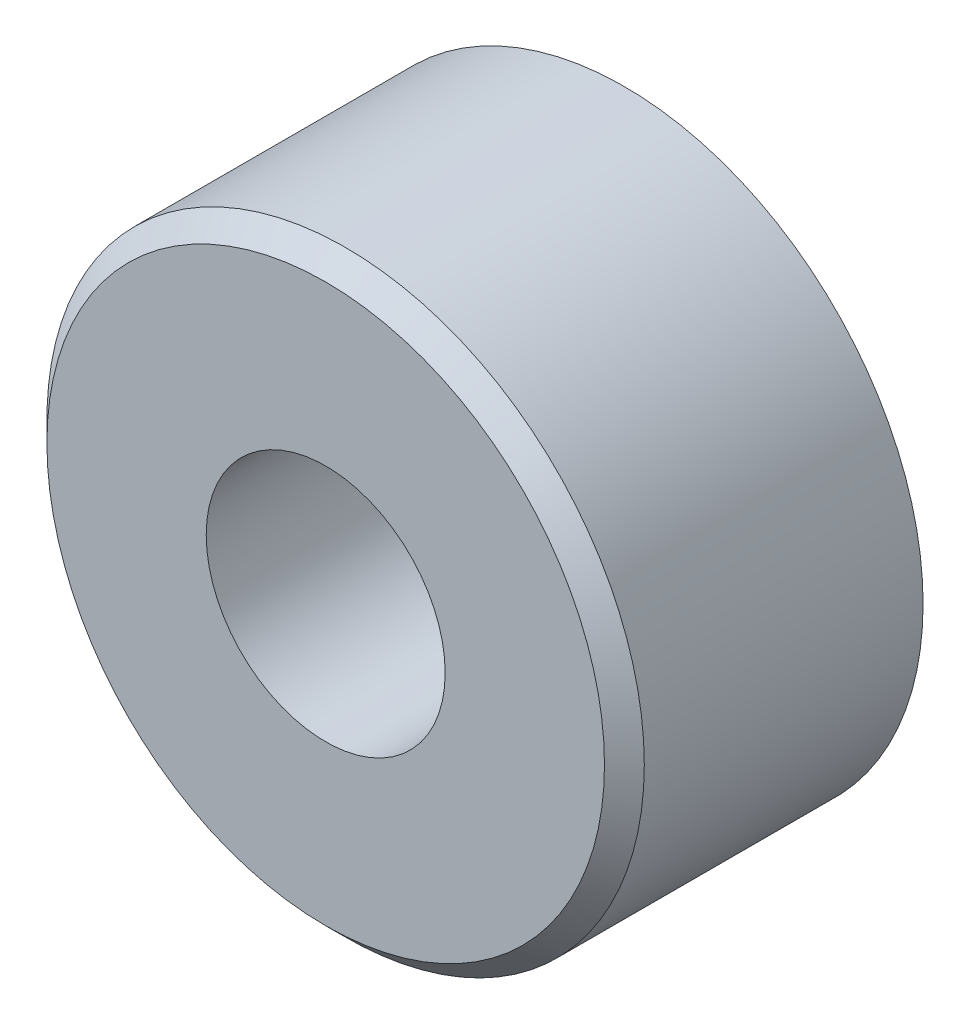
ISO-10303-21;
HEADER;
FILE_DESCRIPTION(('STEP AP214'),'2;1');
FILE_NAME('part.step','',(''),(''),'','','');
FILE_SCHEMA(('AUTOMOTIVE_DESIGN { 1 0 10303 214 1 1 1 1 }'));
ENDSEC;
DATA;
#1=APPLICATION_CONTEXT('core data for automotive mechanical design processes');
#2=APPLICATION_PROTOCOL_DEFINITION('international standard','automotive_design',2000,#1);
#3=PRODUCT_CONTEXT('',#1,'mechanical');
#4=PRODUCT('Part','Part','',(#3));
#5=PRODUCT_RELATED_PRODUCT_CATEGORY('part','',(#4));
#6=PRODUCT_DEFINITION_FORMATION('','',#4);
#7=PRODUCT_DEFINITION_CONTEXT('part definition',#1,'design');
#8=PRODUCT_DEFINITION('design','',#6,#7);
#9=PRODUCT_DEFINITION_SHAPE('','',#8);
#10=(LENGTH_UNIT() NAMED_UNIT(*) SI_UNIT(.MILLI.,.METRE.));
#11=(NAMED_UNIT(*) PLANE_ANGLE_UNIT() SI_UNIT($,.RADIAN.));
#12=(NAMED_UNIT(*) SI_UNIT($,.STERADIAN.) SOLID_ANGLE_UNIT());
#13=UNCERTAINTY_MEASURE_WITH_UNIT(LENGTH_MEASURE(1.E-05),#10,'distance_accuracy_value','');
#14=(GEOMETRIC_REPRESENTATION_CONTEXT(3) GLOBAL_UNCERTAINTY_ASSIGNED_CONTEXT((#13)) GLOBAL_UNIT_ASSIGNED_CONTEXT((#10,
#11,#12)) REPRESENTATION_CONTEXT('',''));
#15=CARTESIAN_POINT('',(0.,0.,0.));
#16=DIRECTION('',(0.,0.,1.));
#17=DIRECTION('',(1.,0.,0.));
#18=AXIS2_PLACEMENT_3D('',#15,#16,#17);
#19=CARTESIAN_POINT('',(0.,0.,7.5));
#20=DIRECTION('',(0.,0.,1.));
#21=DIRECTION('',(1.,0.,0.));
#22=AXIS2_PLACEMENT_3D('',#19,#20,#21);
#23=PLANE('',#22);
#24=CARTESIAN_POINT('',(0.,0.,7.5));
#25=DIRECTION('',(0.,0.,1.));
#26=DIRECTION('',(1.,0.,0.));
#27=AXIS2_PLACEMENT_3D('',#24,#25,#26);
#28=CIRCLE('',#27,7.);
#29=CARTESIAN_POINT('',(7.,0.,7.5));
#30=VERTEX_POINT('',#29);
#31=EDGE_CURVE('E49',#30,#30,#28,.T.);
#32=ORIENTED_EDGE('',*,*,#31,.T.);
#33=EDGE_LOOP('',(#32));
#34=FACE_BOUND('',#33,.T.);
#35=CARTESIAN_POINT('',(0.,0.,7.5));
#36=DIRECTION('',(0.,0.,1.));
#37=DIRECTION('',(1.,0.,0.));
#38=AXIS2_PLACEMENT_3D('',#35,#36,#37);
#39=CIRCLE('',#38,3.);
#40=CARTESIAN_POINT('',(3.,0.,7.5));
#41=VERTEX_POINT('',#40);
#42=EDGE_CURVE('E59',#41,#41,#39,.T.);
#43=ORIENTED_EDGE('',*,*,#42,.F.);
#44=EDGE_LOOP('',(#43));
#45=FACE_BOUND('',#44,.T.);
#46=ADVANCED_FACE('F41',(#34,#45),#23,.T.);
#47=CARTESIAN_POINT('',(0.,0.,0.));
#48=DIRECTION('',(0.,0.,1.));
#49=DIRECTION('',(1.,0.,0.));
#50=AXIS2_PLACEMENT_3D('',#47,#48,#49);
#51=PLANE('',#50);
#52=CARTESIAN_POINT('',(0.,0.,0.));
#53=DIRECTION('',(0.,0.,1.));
#54=DIRECTION('',(1.,0.,0.));
#55=AXIS2_PLACEMENT_3D('',#52,#53,#54);
#56=CIRCLE('',#55,7.5);
#57=CARTESIAN_POINT('',(7.5,0.,0.));
#58=VERTEX_POINT('',#57);
#59=EDGE_CURVE('E54',#58,#58,#56,.T.);
#60=ORIENTED_EDGE('',*,*,#59,.F.);
#61=EDGE_LOOP('',(#60));
#62=FACE_BOUND('',#61,.T.);
#63=CARTESIAN_POINT('',(0.,0.,0.));
#64=DIRECTION('',(0.,0.,1.));
#65=DIRECTION('',(1.,0.,0.));
#66=AXIS2_PLACEMENT_3D('',#63,#64,#65);
#67=CIRCLE('',#66,3.);
#68=CARTESIAN_POINT('',(3.,0.,0.));
#69=VERTEX_POINT('',#68);
#70=EDGE_CURVE('E62',#69,#69,#67,.T.);
#71=ORIENTED_EDGE('',*,*,#70,.T.);
#72=EDGE_LOOP('',(#71));
#73=FACE_BOUND('',#72,.T.);
#74=ADVANCED_FACE('F74',(#62,#73),#51,.F.);
#75=CARTESIAN_POINT('',(0.,0.,7.5));
#76=DIRECTION('',(0.,0.,-1.));
#77=DIRECTION('',(-1.,0.,0.));
#78=AXIS2_PLACEMENT_3D('',#75,#76,#77);
#79=CYLINDRICAL_SURFACE('',#78,7.5);
#80=CARTESIAN_POINT('',(0.,0.,7.));
#81=DIRECTION('',(0.,0.,1.));
#82=DIRECTION('',(1.,0.,0.));
#83=AXIS2_PLACEMENT_3D('',#80,#81,#82);
#84=CIRCLE('',#83,7.5);
#85=CARTESIAN_POINT('',(7.5,0.,7.));
#86=VERTEX_POINT('',#85);
#87=EDGE_CURVE('E10',#86,#86,#84,.F.);
#88=ORIENTED_EDGE('',*,*,#87,.T.);
#89=EDGE_LOOP('',(#88));
#90=FACE_BOUND('',#89,.T.);
#91=ORIENTED_EDGE('',*,*,#59,.T.);
#92=EDGE_LOOP('',(#91));
#93=FACE_BOUND('',#92,.T.);
#94=ADVANCED_FACE('F79',(#90,#93),#79,.T.);
#95=CARTESIAN_POINT('',(0.,0.,7.5));
#96=DIRECTION('',(0.,0.,-1.));
#97=DIRECTION('',(-1.,0.,0.));
#98=AXIS2_PLACEMENT_3D('',#95,#96,#97);
#99=CYLINDRICAL_SURFACE('',#98,3.);
#100=ORIENTED_EDGE('',*,*,#42,.T.);
#101=EDGE_LOOP('',(#100));
#102=FACE_BOUND('',#101,.T.);
#103=ORIENTED_EDGE('',*,*,#70,.F.);
#104=EDGE_LOOP('',(#103));
#105=FACE_BOUND('',#104,.T.);
#106=ADVANCED_FACE('F70',(#102,#105),#99,.F.);
#107=CARTESIAN_POINT('',(0.,0.,7.5));
#108=DIRECTION('',(0.,0.,-1.));
#109=DIRECTION('',(-1.,0.,0.));
#110=AXIS2_PLACEMENT_3D('',#107,#108,#109);
#111=CONICAL_SURFACE('',#110,7.,0.785398163397447);
#112=ORIENTED_EDGE('',*,*,#87,.F.);
#113=EDGE_LOOP('',(#112));
#114=FACE_BOUND('',#113,.T.);
#115=ORIENTED_EDGE('',*,*,#31,.F.);
#116=EDGE_LOOP('',(#115));
#117=FACE_BOUND('',#116,.T.);
#118=ADVANCED_FACE('F43',(#114,#117),#111,.T.);
#119=CLOSED_SHELL('',(#46,#74,#94,#106,#118));
#120=MANIFOLD_SOLID_BREP('B2',#119);
#121=ADVANCED_BREP_SHAPE_REPRESENTATION('',(#18,#120),#14);
#122=SHAPE_DEFINITION_REPRESENTATION(#9,#121);
ENDSEC;
END-ISO-10303-21;
